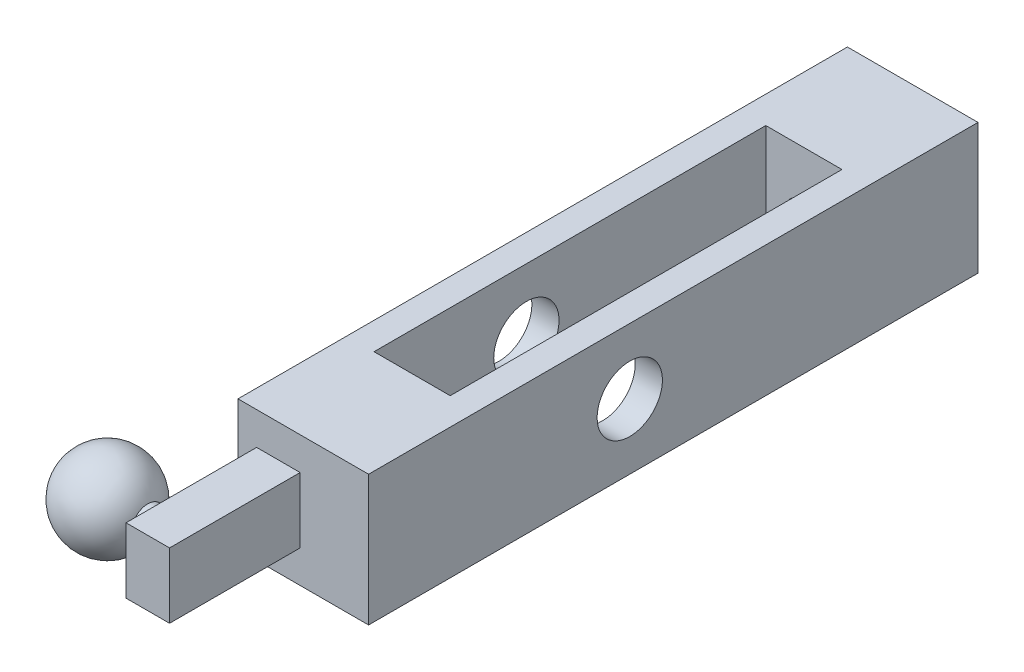
ISO-10303-21;
HEADER;
FILE_DESCRIPTION(('STEP AP214'),'2;1');
FILE_NAME('part.step','',(''),(''),'','','');
FILE_SCHEMA(('AUTOMOTIVE_DESIGN { 1 0 10303 214 1 1 1 1 }'));
ENDSEC;
DATA;
#1=APPLICATION_CONTEXT('core data for automotive mechanical design processes');
#2=APPLICATION_PROTOCOL_DEFINITION('international standard','automotive_design',2000,#1);
#3=PRODUCT_CONTEXT('',#1,'mechanical');
#4=PRODUCT('Part','Part','',(#3));
#5=PRODUCT_RELATED_PRODUCT_CATEGORY('part','',(#4));
#6=PRODUCT_DEFINITION_FORMATION('','',#4);
#7=PRODUCT_DEFINITION_CONTEXT('part definition',#1,'design');
#8=PRODUCT_DEFINITION('design','',#6,#7);
#9=PRODUCT_DEFINITION_SHAPE('','',#8);
#10=(LENGTH_UNIT() NAMED_UNIT(*) SI_UNIT(.MILLI.,.METRE.));
#11=(NAMED_UNIT(*) PLANE_ANGLE_UNIT() SI_UNIT($,.RADIAN.));
#12=(NAMED_UNIT(*) SI_UNIT($,.STERADIAN.) SOLID_ANGLE_UNIT());
#13=UNCERTAINTY_MEASURE_WITH_UNIT(LENGTH_MEASURE(1.E-05),#10,'distance_accuracy_value','');
#14=(GEOMETRIC_REPRESENTATION_CONTEXT(3) GLOBAL_UNCERTAINTY_ASSIGNED_CONTEXT((#13)) GLOBAL_UNIT_ASSIGNED_CONTEXT((#10,
#11,#12)) REPRESENTATION_CONTEXT('',''));
#15=CARTESIAN_POINT('',(0.,0.,0.));
#16=DIRECTION('',(0.,0.,1.));
#17=DIRECTION('',(1.,0.,0.));
#18=AXIS2_PLACEMENT_3D('',#15,#16,#17);
#19=CARTESIAN_POINT('',(3.,-3.,28.));
#20=DIRECTION('',(0.,1.,0.));
#21=DIRECTION('',(-1.,0.,0.));
#22=AXIS2_PLACEMENT_3D('',#19,#20,#21);
#23=PLANE('',#22);
#24=DIRECTION('',(1.,0.,0.));
#25=VECTOR('',#24,1.);
#26=CARTESIAN_POINT('',(3.,-3.,0.));
#27=LINE('',#26,#25);
#28=CARTESIAN_POINT('',(-3.,-3.,0.));
#29=VERTEX_POINT('',#28);
#30=CARTESIAN_POINT('',(3.,-3.,0.));
#31=VERTEX_POINT('',#30);
#32=EDGE_CURVE('E218',#29,#31,#27,.T.);
#33=ORIENTED_EDGE('',*,*,#32,.T.);
#34=DIRECTION('',(0.,0.,-1.));
#35=VECTOR('',#34,1.);
#36=CARTESIAN_POINT('',(3.,-3.,28.));
#37=LINE('',#36,#35);
#38=CARTESIAN_POINT('',(3.,-3.,28.));
#39=VERTEX_POINT('',#38);
#40=EDGE_CURVE('E228',#39,#31,#37,.T.);
#41=ORIENTED_EDGE('',*,*,#40,.F.);
#42=DIRECTION('',(1.,0.,0.));
#43=VECTOR('',#42,1.);
#44=CARTESIAN_POINT('',(3.,-3.,28.));
#45=LINE('',#44,#43);
#46=CARTESIAN_POINT('',(-3.,-3.,28.));
#47=VERTEX_POINT('',#46);
#48=EDGE_CURVE('E208',#47,#39,#45,.T.);
#49=ORIENTED_EDGE('',*,*,#48,.F.);
#50=DIRECTION('',(0.,0.,-1.));
#51=VECTOR('',#50,1.);
#52=CARTESIAN_POINT('',(-3.,-3.,28.));
#53=LINE('',#52,#51);
#54=EDGE_CURVE('E50',#47,#29,#53,.T.);
#55=ORIENTED_EDGE('',*,*,#54,.T.);
#56=EDGE_LOOP('',(#33,#41,#49,#55));
#57=FACE_BOUND('',#56,.T.);
#58=DIRECTION('',(1.,0.,0.));
#59=VECTOR('',#58,1.);
#60=CARTESIAN_POINT('',(3.,-3.,5.));
#61=LINE('',#60,#59);
#62=CARTESIAN_POINT('',(-1.75,-3.,5.));
#63=VERTEX_POINT('',#62);
#64=CARTESIAN_POINT('',(1.75,-3.,5.));
#65=VERTEX_POINT('',#64);
#66=EDGE_CURVE('E135',#63,#65,#61,.T.);
#67=ORIENTED_EDGE('',*,*,#66,.F.);
#68=DIRECTION('',(0.,0.,-1.));
#69=VECTOR('',#68,1.);
#70=CARTESIAN_POINT('',(-1.75,-3.,28.));
#71=LINE('',#70,#69);
#72=CARTESIAN_POINT('',(-1.75,-3.,23.));
#73=VERTEX_POINT('',#72);
#74=EDGE_CURVE('E138',#73,#63,#71,.T.);
#75=ORIENTED_EDGE('',*,*,#74,.F.);
#76=DIRECTION('',(-1.,0.,0.));
#77=VECTOR('',#76,1.);
#78=CARTESIAN_POINT('',(3.,-3.,23.));
#79=LINE('',#78,#77);
#80=CARTESIAN_POINT('',(1.75,-3.,23.));
#81=VERTEX_POINT('',#80);
#82=EDGE_CURVE('E167',#81,#73,#79,.T.);
#83=ORIENTED_EDGE('',*,*,#82,.F.);
#84=DIRECTION('',(0.,0.,1.));
#85=VECTOR('',#84,1.);
#86=CARTESIAN_POINT('',(1.75,-3.,28.));
#87=LINE('',#86,#85);
#88=EDGE_CURVE('E169',#65,#81,#87,.T.);
#89=ORIENTED_EDGE('',*,*,#88,.F.);
#90=EDGE_LOOP('',(#67,#75,#83,#89));
#91=FACE_BOUND('',#90,.T.);
#92=ADVANCED_FACE('F41',(#57,#91),#23,.F.);
#93=CARTESIAN_POINT('',(3.,3.,28.));
#94=DIRECTION('',(0.,-1.,0.));
#95=DIRECTION('',(1.,0.,0.));
#96=AXIS2_PLACEMENT_3D('',#93,#94,#95);
#97=PLANE('',#96);
#98=DIRECTION('',(-1.,0.,0.));
#99=VECTOR('',#98,1.);
#100=CARTESIAN_POINT('',(3.,3.,0.));
#101=LINE('',#100,#99);
#102=CARTESIAN_POINT('',(3.,3.,0.));
#103=VERTEX_POINT('',#102);
#104=CARTESIAN_POINT('',(-3.,3.,0.));
#105=VERTEX_POINT('',#104);
#106=EDGE_CURVE('E209',#103,#105,#101,.T.);
#107=ORIENTED_EDGE('',*,*,#106,.T.);
#108=DIRECTION('',(0.,0.,-1.));
#109=VECTOR('',#108,1.);
#110=CARTESIAN_POINT('',(-3.,3.,28.));
#111=LINE('',#110,#109);
#112=CARTESIAN_POINT('',(-3.,3.,28.));
#113=VERTEX_POINT('',#112);
#114=EDGE_CURVE('E215',#113,#105,#111,.T.);
#115=ORIENTED_EDGE('',*,*,#114,.F.);
#116=DIRECTION('',(-1.,0.,0.));
#117=VECTOR('',#116,1.);
#118=CARTESIAN_POINT('',(3.,3.,28.));
#119=LINE('',#118,#117);
#120=CARTESIAN_POINT('',(3.,3.,28.));
#121=VERTEX_POINT('',#120);
#122=EDGE_CURVE('E213',#121,#113,#119,.T.);
#123=ORIENTED_EDGE('',*,*,#122,.F.);
#124=DIRECTION('',(0.,0.,-1.));
#125=VECTOR('',#124,1.);
#126=CARTESIAN_POINT('',(3.,3.,28.));
#127=LINE('',#126,#125);
#128=EDGE_CURVE('E225',#121,#103,#127,.T.);
#129=ORIENTED_EDGE('',*,*,#128,.T.);
#130=EDGE_LOOP('',(#107,#115,#123,#129));
#131=FACE_BOUND('',#130,.T.);
#132=DIRECTION('',(1.,0.,0.));
#133=VECTOR('',#132,1.);
#134=CARTESIAN_POINT('',(-1.75,3.,5.));
#135=LINE('',#134,#133);
#136=CARTESIAN_POINT('',(-1.75,3.,5.));
#137=VERTEX_POINT('',#136);
#138=CARTESIAN_POINT('',(1.75,3.,5.));
#139=VERTEX_POINT('',#138);
#140=EDGE_CURVE('E66',#137,#139,#135,.T.);
#141=ORIENTED_EDGE('',*,*,#140,.T.);
#142=DIRECTION('',(0.,0.,1.));
#143=VECTOR('',#142,1.);
#144=CARTESIAN_POINT('',(1.75,3.,5.));
#145=LINE('',#144,#143);
#146=CARTESIAN_POINT('',(1.75,3.,23.));
#147=VERTEX_POINT('',#146);
#148=EDGE_CURVE('E142',#139,#147,#145,.T.);
#149=ORIENTED_EDGE('',*,*,#148,.T.);
#150=DIRECTION('',(-1.,0.,0.));
#151=VECTOR('',#150,1.);
#152=CARTESIAN_POINT('',(-1.75,3.,23.));
#153=LINE('',#152,#151);
#154=CARTESIAN_POINT('',(-1.75,3.,23.));
#155=VERTEX_POINT('',#154);
#156=EDGE_CURVE('E148',#147,#155,#153,.T.);
#157=ORIENTED_EDGE('',*,*,#156,.T.);
#158=DIRECTION('',(0.,0.,-1.));
#159=VECTOR('',#158,1.);
#160=CARTESIAN_POINT('',(-1.75,3.,5.));
#161=LINE('',#160,#159);
#162=EDGE_CURVE('E152',#155,#137,#161,.T.);
#163=ORIENTED_EDGE('',*,*,#162,.T.);
#164=EDGE_LOOP('',(#141,#149,#157,#163));
#165=FACE_BOUND('',#164,.T.);
#166=ADVANCED_FACE('F151',(#131,#165),#97,.F.);
#167=CARTESIAN_POINT('',(0.,0.,28.));
#168=DIRECTION('',(0.,0.,1.));
#169=DIRECTION('',(1.,0.,0.));
#170=AXIS2_PLACEMENT_3D('',#167,#168,#169);
#171=PLANE('',#170);
#172=DIRECTION('',(0.,-1.,0.));
#173=VECTOR('',#172,1.);
#174=CARTESIAN_POINT('',(-3.,-3.,28.));
#175=LINE('',#174,#173);
#176=EDGE_CURVE('E205',#113,#47,#175,.T.);
#177=ORIENTED_EDGE('',*,*,#176,.T.);
#178=ORIENTED_EDGE('',*,*,#48,.T.);
#179=DIRECTION('',(0.,1.,0.));
#180=VECTOR('',#179,1.);
#181=CARTESIAN_POINT('',(3.,-3.,28.));
#182=LINE('',#181,#180);
#183=EDGE_CURVE('E211',#39,#121,#182,.T.);
#184=ORIENTED_EDGE('',*,*,#183,.T.);
#185=ORIENTED_EDGE('',*,*,#122,.T.);
#186=EDGE_LOOP('',(#177,#178,#184,#185));
#187=FACE_BOUND('',#186,.T.);
#188=DIRECTION('',(-1.,0.,0.));
#189=VECTOR('',#188,1.);
#190=CARTESIAN_POINT('',(-2.14479354998716,1.49545918544692,28.));
#191=LINE('',#190,#189);
#192=CARTESIAN_POINT('',(-0.144793549987163,1.49545918544692,28.));
#193=VERTEX_POINT('',#192);
#194=CARTESIAN_POINT('',(-2.14479354998716,1.49545918544692,28.));
#195=VERTEX_POINT('',#194);
#196=EDGE_CURVE('E189',#193,#195,#191,.T.);
#197=ORIENTED_EDGE('',*,*,#196,.F.);
#198=DIRECTION('',(0.,1.,0.));
#199=VECTOR('',#198,1.);
#200=CARTESIAN_POINT('',(-0.144793549987163,1.49545918544692,28.));
#201=LINE('',#200,#199);
#202=CARTESIAN_POINT('',(-0.144793549987163,-1.50454081455308,28.));
#203=VERTEX_POINT('',#202);
#204=EDGE_CURVE('E175',#203,#193,#201,.T.);
#205=ORIENTED_EDGE('',*,*,#204,.F.);
#206=DIRECTION('',(1.,0.,0.));
#207=VECTOR('',#206,1.);
#208=CARTESIAN_POINT('',(-2.14479354998716,-1.50454081455308,28.));
#209=LINE('',#208,#207);
#210=CARTESIAN_POINT('',(-2.14479354998716,-1.50454081455308,28.));
#211=VERTEX_POINT('',#210);
#212=EDGE_CURVE('E180',#211,#203,#209,.T.);
#213=ORIENTED_EDGE('',*,*,#212,.F.);
#214=DIRECTION('',(0.,-1.,0.));
#215=VECTOR('',#214,1.);
#216=CARTESIAN_POINT('',(-2.14479354998716,1.49545918544692,28.));
#217=LINE('',#216,#215);
#218=EDGE_CURVE('E191',#195,#211,#217,.T.);
#219=ORIENTED_EDGE('',*,*,#218,.F.);
#220=EDGE_LOOP('',(#197,#205,#213,#219));
#221=FACE_BOUND('',#220,.T.);
#222=ADVANCED_FACE('F272',(#187,#221),#171,.T.);
#223=CARTESIAN_POINT('',(-3.,-3.,28.));
#224=DIRECTION('',(1.,0.,0.));
#225=DIRECTION('',(0.,0.,-1.));
#226=AXIS2_PLACEMENT_3D('',#223,#224,#225);
#227=PLANE('',#226);
#228=CARTESIAN_POINT('',(-3.,0.,16.));
#229=DIRECTION('',(-1.,0.,0.));
#230=DIRECTION('',(0.,0.,1.));
#231=AXIS2_PLACEMENT_3D('',#228,#229,#230);
#232=CIRCLE('',#231,1.5);
#233=CARTESIAN_POINT('',(-3.,0.,17.5));
#234=VERTEX_POINT('',#233);
#235=EDGE_CURVE('E234',#234,#234,#232,.T.);
#236=ORIENTED_EDGE('',*,*,#235,.F.);
#237=EDGE_LOOP('',(#236));
#238=FACE_BOUND('',#237,.T.);
#239=DIRECTION('',(0.,-1.,0.));
#240=VECTOR('',#239,1.);
#241=CARTESIAN_POINT('',(-3.,-3.,0.));
#242=LINE('',#241,#240);
#243=EDGE_CURVE('E204',#105,#29,#242,.T.);
#244=ORIENTED_EDGE('',*,*,#243,.T.);
#245=ORIENTED_EDGE('',*,*,#54,.F.);
#246=ORIENTED_EDGE('',*,*,#176,.F.);
#247=ORIENTED_EDGE('',*,*,#114,.T.);
#248=EDGE_LOOP('',(#244,#245,#246,#247));
#249=FACE_BOUND('',#248,.T.);
#250=ADVANCED_FACE('F43',(#238,#249),#227,.F.);
#251=CARTESIAN_POINT('',(3.,-3.,28.));
#252=DIRECTION('',(-1.,0.,0.));
#253=DIRECTION('',(0.,0.,1.));
#254=AXIS2_PLACEMENT_3D('',#251,#252,#253);
#255=PLANE('',#254);
#256=CARTESIAN_POINT('',(3.,0.,16.));
#257=DIRECTION('',(-1.,0.,0.));
#258=DIRECTION('',(0.,0.,1.));
#259=AXIS2_PLACEMENT_3D('',#256,#257,#258);
#260=CIRCLE('',#259,1.5);
#261=CARTESIAN_POINT('',(3.,0.,17.5));
#262=VERTEX_POINT('',#261);
#263=EDGE_CURVE('E153',#262,#262,#260,.T.);
#264=ORIENTED_EDGE('',*,*,#263,.T.);
#265=EDGE_LOOP('',(#264));
#266=FACE_BOUND('',#265,.T.);
#267=DIRECTION('',(0.,1.,0.));
#268=VECTOR('',#267,1.);
#269=CARTESIAN_POINT('',(3.,-3.,0.));
#270=LINE('',#269,#268);
#271=EDGE_CURVE('E220',#31,#103,#270,.T.);
#272=ORIENTED_EDGE('',*,*,#271,.T.);
#273=ORIENTED_EDGE('',*,*,#128,.F.);
#274=ORIENTED_EDGE('',*,*,#183,.F.);
#275=ORIENTED_EDGE('',*,*,#40,.T.);
#276=EDGE_LOOP('',(#272,#273,#274,#275));
#277=FACE_BOUND('',#276,.T.);
#278=ADVANCED_FACE('F254',(#266,#277),#255,.F.);
#279=CARTESIAN_POINT('',(0.,0.,0.));
#280=DIRECTION('',(0.,0.,1.));
#281=DIRECTION('',(1.,0.,0.));
#282=AXIS2_PLACEMENT_3D('',#279,#280,#281);
#283=PLANE('',#282);
#284=CARTESIAN_POINT('',(0.,0.,0.));
#285=DIRECTION('',(0.,0.,-1.));
#286=DIRECTION('',(-1.,0.,0.));
#287=AXIS2_PLACEMENT_3D('',#284,#285,#286);
#288=CIRCLE('',#287,0.9);
#289=CARTESIAN_POINT('',(-0.9,0.,0.));
#290=VERTEX_POINT('',#289);
#291=EDGE_CURVE('E243',#290,#290,#288,.T.);
#292=ORIENTED_EDGE('',*,*,#291,.F.);
#293=EDGE_LOOP('',(#292));
#294=FACE_BOUND('',#293,.T.);
#295=ORIENTED_EDGE('',*,*,#243,.F.);
#296=ORIENTED_EDGE('',*,*,#106,.F.);
#297=ORIENTED_EDGE('',*,*,#271,.F.);
#298=ORIENTED_EDGE('',*,*,#32,.F.);
#299=EDGE_LOOP('',(#295,#296,#297,#298));
#300=FACE_BOUND('',#299,.T.);
#301=ADVANCED_FACE('F250',(#294,#300),#283,.F.);
#302=CARTESIAN_POINT('',(-0.144793549987163,1.49545918544692,34.));
#303=DIRECTION('',(-1.,0.,0.));
#304=DIRECTION('',(0.,-1.,0.));
#305=AXIS2_PLACEMENT_3D('',#302,#303,#304);
#306=PLANE('',#305);
#307=ORIENTED_EDGE('',*,*,#204,.T.);
#308=DIRECTION('',(0.,0.,-1.));
#309=VECTOR('',#308,1.);
#310=CARTESIAN_POINT('',(-0.144793549987163,1.49545918544692,34.));
#311=LINE('',#310,#309);
#312=CARTESIAN_POINT('',(-0.144793549987163,1.49545918544692,34.));
#313=VERTEX_POINT('',#312);
#314=EDGE_CURVE('E202',#313,#193,#311,.T.);
#315=ORIENTED_EDGE('',*,*,#314,.F.);
#316=DIRECTION('',(0.,1.,0.));
#317=VECTOR('',#316,1.);
#318=CARTESIAN_POINT('',(-0.144793549987163,1.49545918544692,34.));
#319=LINE('',#318,#317);
#320=CARTESIAN_POINT('',(-0.144793549987163,-1.50454081455308,34.));
#321=VERTEX_POINT('',#320);
#322=EDGE_CURVE('E176',#321,#313,#319,.T.);
#323=ORIENTED_EDGE('',*,*,#322,.F.);
#324=DIRECTION('',(0.,0.,-1.));
#325=VECTOR('',#324,1.);
#326=CARTESIAN_POINT('',(-0.144793549987163,-1.50454081455308,34.));
#327=LINE('',#326,#325);
#328=EDGE_CURVE('E186',#321,#203,#327,.T.);
#329=ORIENTED_EDGE('',*,*,#328,.T.);
#330=EDGE_LOOP('',(#307,#315,#323,#329));
#331=FACE_BOUND('',#330,.T.);
#332=ADVANCED_FACE('F253',(#331),#306,.F.);
#333=CARTESIAN_POINT('',(-2.14479354998716,1.49545918544692,34.));
#334=DIRECTION('',(0.,-1.,0.));
#335=DIRECTION('',(1.,0.,0.));
#336=AXIS2_PLACEMENT_3D('',#333,#334,#335);
#337=PLANE('',#336);
#338=ORIENTED_EDGE('',*,*,#196,.T.);
#339=DIRECTION('',(0.,0.,-1.));
#340=VECTOR('',#339,1.);
#341=CARTESIAN_POINT('',(-2.14479354998716,1.49545918544692,34.));
#342=LINE('',#341,#340);
#343=CARTESIAN_POINT('',(-2.14479354998716,1.49545918544692,34.));
#344=VERTEX_POINT('',#343);
#345=EDGE_CURVE('E199',#344,#195,#342,.T.);
#346=ORIENTED_EDGE('',*,*,#345,.F.);
#347=DIRECTION('',(-1.,0.,0.));
#348=VECTOR('',#347,1.);
#349=CARTESIAN_POINT('',(-2.14479354998716,1.49545918544692,34.));
#350=LINE('',#349,#348);
#351=EDGE_CURVE('E179',#313,#344,#350,.T.);
#352=ORIENTED_EDGE('',*,*,#351,.F.);
#353=ORIENTED_EDGE('',*,*,#314,.T.);
#354=EDGE_LOOP('',(#338,#346,#352,#353));
#355=FACE_BOUND('',#354,.T.);
#356=ADVANCED_FACE('F282',(#355),#337,.F.);
#357=CARTESIAN_POINT('',(-2.14479354998716,1.49545918544692,34.));
#358=DIRECTION('',(1.,0.,0.));
#359=DIRECTION('',(0.,1.,0.));
#360=AXIS2_PLACEMENT_3D('',#357,#358,#359);
#361=PLANE('',#360);
#362=CARTESIAN_POINT('',(-2.14479354998716,0.,32.));
#363=DIRECTION('',(1.,0.,0.));
#364=DIRECTION('',(0.,1.,0.));
#365=AXIS2_PLACEMENT_3D('',#362,#363,#364);
#366=CIRCLE('',#365,0.749999999999999);
#367=CARTESIAN_POINT('',(-2.14479354998716,0.749999999999998,32.));
#368=VERTEX_POINT('',#367);
#369=EDGE_CURVE('E11',#368,#368,#366,.F.);
#370=ORIENTED_EDGE('',*,*,#369,.F.);
#371=EDGE_LOOP('',(#370));
#372=FACE_BOUND('',#371,.T.);
#373=ORIENTED_EDGE('',*,*,#218,.T.);
#374=DIRECTION('',(0.,0.,-1.));
#375=VECTOR('',#374,1.);
#376=CARTESIAN_POINT('',(-2.14479354998716,-1.50454081455308,34.));
#377=LINE('',#376,#375);
#378=CARTESIAN_POINT('',(-2.14479354998716,-1.50454081455308,34.));
#379=VERTEX_POINT('',#378);
#380=EDGE_CURVE('E197',#379,#211,#377,.T.);
#381=ORIENTED_EDGE('',*,*,#380,.F.);
#382=DIRECTION('',(0.,-1.,0.));
#383=VECTOR('',#382,1.);
#384=CARTESIAN_POINT('',(-2.14479354998716,1.49545918544692,34.));
#385=LINE('',#384,#383);
#386=EDGE_CURVE('E182',#344,#379,#385,.T.);
#387=ORIENTED_EDGE('',*,*,#386,.F.);
#388=ORIENTED_EDGE('',*,*,#345,.T.);
#389=EDGE_LOOP('',(#373,#381,#387,#388));
#390=FACE_BOUND('',#389,.T.);
#391=ADVANCED_FACE('F286',(#372,#390),#361,.F.);
#392=CARTESIAN_POINT('',(-2.14479354998716,-1.50454081455308,34.));
#393=DIRECTION('',(0.,1.,0.));
#394=DIRECTION('',(-1.,0.,0.));
#395=AXIS2_PLACEMENT_3D('',#392,#393,#394);
#396=PLANE('',#395);
#397=ORIENTED_EDGE('',*,*,#212,.T.);
#398=ORIENTED_EDGE('',*,*,#328,.F.);
#399=DIRECTION('',(1.,0.,0.));
#400=VECTOR('',#399,1.);
#401=CARTESIAN_POINT('',(-2.14479354998716,-1.50454081455308,34.));
#402=LINE('',#401,#400);
#403=EDGE_CURVE('E184',#379,#321,#402,.T.);
#404=ORIENTED_EDGE('',*,*,#403,.F.);
#405=ORIENTED_EDGE('',*,*,#380,.T.);
#406=EDGE_LOOP('',(#397,#398,#404,#405));
#407=FACE_BOUND('',#406,.T.);
#408=ADVANCED_FACE('F295',(#407),#396,.F.);
#409=CARTESIAN_POINT('',(0.,0.,34.));
#410=DIRECTION('',(0.,0.,1.));
#411=DIRECTION('',(1.,0.,0.));
#412=AXIS2_PLACEMENT_3D('',#409,#410,#411);
#413=PLANE('',#412);
#414=ORIENTED_EDGE('',*,*,#322,.T.);
#415=ORIENTED_EDGE('',*,*,#351,.T.);
#416=ORIENTED_EDGE('',*,*,#386,.T.);
#417=ORIENTED_EDGE('',*,*,#403,.T.);
#418=EDGE_LOOP('',(#414,#415,#416,#417));
#419=FACE_BOUND('',#418,.T.);
#420=ADVANCED_FACE('F290',(#419),#413,.T.);
#421=CARTESIAN_POINT('',(-3.14479354998716,0.,32.));
#422=DIRECTION('',(1.,0.,0.));
#423=DIRECTION('',(0.,1.,0.));
#424=AXIS2_PLACEMENT_3D('',#421,#422,#423);
#425=CYLINDRICAL_SURFACE('',#424,0.749999999999999);
#426=CARTESIAN_POINT('',(-3.14479354998716,0.,32.));
#427=DIRECTION('',(-1.,0.,0.));
#428=DIRECTION('',(0.,-1.,0.));
#429=AXIS2_PLACEMENT_3D('',#426,#427,#428);
#430=CIRCLE('',#429,0.749999999999999);
#431=CARTESIAN_POINT('',(-3.14479354998716,-0.749999999999999,32.));
#432=VERTEX_POINT('',#431);
#433=EDGE_CURVE('E172',#432,#432,#430,.T.);
#434=ORIENTED_EDGE('',*,*,#433,.F.);
#435=EDGE_LOOP('',(#434));
#436=FACE_BOUND('',#435,.T.);
#437=ORIENTED_EDGE('',*,*,#369,.T.);
#438=EDGE_LOOP('',(#437));
#439=FACE_BOUND('',#438,.T.);
#440=ADVANCED_FACE('F302',(#436,#439),#425,.T.);
#441=CARTESIAN_POINT('',(-4.99884317176108,0.,32.));
#442=DIRECTION('',(1.,0.,0.));
#443=DIRECTION('',(0.,0.,-1.));
#444=AXIS2_PLACEMENT_3D('',#441,#442,#443);
#445=SPHERICAL_SURFACE('',#444,2.);
#446=ORIENTED_EDGE('',*,*,#433,.T.);
#447=EDGE_LOOP('',(#446));
#448=FACE_BOUND('',#447,.T.);
#449=ADVANCED_FACE('F360',(#448),#445,.T.);
#450=CARTESIAN_POINT('',(-1.75,-5.,5.));
#451=DIRECTION('',(0.,0.,1.));
#452=DIRECTION('',(1.,0.,0.));
#453=AXIS2_PLACEMENT_3D('',#450,#451,#452);
#454=PLANE('',#453);
#455=CARTESIAN_POINT('',(0.,0.,5.));
#456=DIRECTION('',(0.,0.,1.));
#457=DIRECTION('',(1.,0.,0.));
#458=AXIS2_PLACEMENT_3D('',#455,#456,#457);
#459=CIRCLE('',#458,0.9);
#460=CARTESIAN_POINT('',(0.9,0.,5.));
#461=VERTEX_POINT('',#460);
#462=EDGE_CURVE('E45',#461,#461,#459,.T.);
#463=ORIENTED_EDGE('',*,*,#462,.F.);
#464=EDGE_LOOP('',(#463));
#465=FACE_BOUND('',#464,.T.);
#466=ORIENTED_EDGE('',*,*,#66,.T.);
#467=DIRECTION('',(0.,1.,0.));
#468=VECTOR('',#467,1.);
#469=CARTESIAN_POINT('',(1.75,-5.,5.));
#470=LINE('',#469,#468);
#471=EDGE_CURVE('E131',#65,#139,#470,.T.);
#472=ORIENTED_EDGE('',*,*,#471,.T.);
#473=ORIENTED_EDGE('',*,*,#140,.F.);
#474=DIRECTION('',(0.,1.,0.));
#475=VECTOR('',#474,1.);
#476=CARTESIAN_POINT('',(-1.75,-5.,5.));
#477=LINE('',#476,#475);
#478=EDGE_CURVE('E162',#63,#137,#477,.T.);
#479=ORIENTED_EDGE('',*,*,#478,.F.);
#480=EDGE_LOOP('',(#466,#472,#473,#479));
#481=FACE_BOUND('',#480,.T.);
#482=ADVANCED_FACE('F133',(#465,#481),#454,.T.);
#483=CARTESIAN_POINT('',(1.75,-5.,5.));
#484=DIRECTION('',(-1.,0.,0.));
#485=DIRECTION('',(0.,-1.,0.));
#486=AXIS2_PLACEMENT_3D('',#483,#484,#485);
#487=PLANE('',#486);
#488=CARTESIAN_POINT('',(1.75,0.,16.));
#489=DIRECTION('',(-1.,0.,0.));
#490=DIRECTION('',(0.,-1.,0.));
#491=AXIS2_PLACEMENT_3D('',#488,#489,#490);
#492=CIRCLE('',#491,1.5);
#493=CARTESIAN_POINT('',(1.75,-1.5,16.));
#494=VERTEX_POINT('',#493);
#495=EDGE_CURVE('E156',#494,#494,#492,.T.);
#496=ORIENTED_EDGE('',*,*,#495,.F.);
#497=EDGE_LOOP('',(#496));
#498=FACE_BOUND('',#497,.T.);
#499=ORIENTED_EDGE('',*,*,#88,.T.);
#500=DIRECTION('',(0.,1.,0.));
#501=VECTOR('',#500,1.);
#502=CARTESIAN_POINT('',(1.75,-5.,23.));
#503=LINE('',#502,#501);
#504=EDGE_CURVE('E139',#81,#147,#503,.T.);
#505=ORIENTED_EDGE('',*,*,#504,.T.);
#506=ORIENTED_EDGE('',*,*,#148,.F.);
#507=ORIENTED_EDGE('',*,*,#471,.F.);
#508=EDGE_LOOP('',(#499,#505,#506,#507));
#509=FACE_BOUND('',#508,.T.);
#510=ADVANCED_FACE('F143',(#498,#509),#487,.T.);
#511=CARTESIAN_POINT('',(-1.75000000000001,-5.,23.));
#512=DIRECTION('',(0.,0.,-1.));
#513=DIRECTION('',(-1.,0.,0.));
#514=AXIS2_PLACEMENT_3D('',#511,#512,#513);
#515=PLANE('',#514);
#516=ORIENTED_EDGE('',*,*,#82,.T.);
#517=DIRECTION('',(0.,1.,0.));
#518=VECTOR('',#517,1.);
#519=CARTESIAN_POINT('',(-1.75000000000001,-5.,23.));
#520=LINE('',#519,#518);
#521=EDGE_CURVE('E58',#73,#155,#520,.T.);
#522=ORIENTED_EDGE('',*,*,#521,.T.);
#523=ORIENTED_EDGE('',*,*,#156,.F.);
#524=ORIENTED_EDGE('',*,*,#504,.F.);
#525=EDGE_LOOP('',(#516,#522,#523,#524));
#526=FACE_BOUND('',#525,.T.);
#527=ADVANCED_FACE('F395',(#526),#515,.T.);
#528=CARTESIAN_POINT('',(-1.75,-5.,5.));
#529=DIRECTION('',(1.,0.,0.));
#530=DIRECTION('',(0.,1.,0.));
#531=AXIS2_PLACEMENT_3D('',#528,#529,#530);
#532=PLANE('',#531);
#533=CARTESIAN_POINT('',(-1.75,0.,16.));
#534=DIRECTION('',(1.,0.,0.));
#535=DIRECTION('',(0.,1.,0.));
#536=AXIS2_PLACEMENT_3D('',#533,#534,#535);
#537=CIRCLE('',#536,1.5);
#538=CARTESIAN_POINT('',(-1.75,1.5,16.));
#539=VERTEX_POINT('',#538);
#540=EDGE_CURVE('E232',#539,#539,#537,.T.);
#541=ORIENTED_EDGE('',*,*,#540,.F.);
#542=EDGE_LOOP('',(#541));
#543=FACE_BOUND('',#542,.T.);
#544=ORIENTED_EDGE('',*,*,#74,.T.);
#545=ORIENTED_EDGE('',*,*,#478,.T.);
#546=ORIENTED_EDGE('',*,*,#162,.F.);
#547=ORIENTED_EDGE('',*,*,#521,.F.);
#548=EDGE_LOOP('',(#544,#545,#546,#547));
#549=FACE_BOUND('',#548,.T.);
#550=ADVANCED_FACE('F403',(#543,#549),#532,.T.);
#551=CARTESIAN_POINT('',(5.,0.,16.));
#552=DIRECTION('',(-1.,0.,0.));
#553=DIRECTION('',(0.,0.,1.));
#554=AXIS2_PLACEMENT_3D('',#551,#552,#553);
#555=CYLINDRICAL_SURFACE('',#554,1.5);
#556=ORIENTED_EDGE('',*,*,#540,.T.);
#557=EDGE_LOOP('',(#556));
#558=FACE_BOUND('',#557,.T.);
#559=ORIENTED_EDGE('',*,*,#235,.T.);
#560=EDGE_LOOP('',(#559));
#561=FACE_BOUND('',#560,.T.);
#562=ADVANCED_FACE('F412',(#558,#561),#555,.F.);
#563=ORIENTED_EDGE('',*,*,#495,.T.);
#564=EDGE_LOOP('',(#563));
#565=FACE_BOUND('',#564,.T.);
#566=ORIENTED_EDGE('',*,*,#263,.F.);
#567=EDGE_LOOP('',(#566));
#568=FACE_BOUND('',#567,.T.);
#569=ADVANCED_FACE('F421',(#565,#568),#555,.F.);
#570=CARTESIAN_POINT('',(0.,0.,8.));
#571=DIRECTION('',(0.,0.,-1.));
#572=DIRECTION('',(-1.,0.,0.));
#573=AXIS2_PLACEMENT_3D('',#570,#571,#572);
#574=CYLINDRICAL_SURFACE('',#573,0.9);
#575=ORIENTED_EDGE('',*,*,#462,.T.);
#576=EDGE_LOOP('',(#575));
#577=FACE_BOUND('',#576,.T.);
#578=ORIENTED_EDGE('',*,*,#291,.T.);
#579=EDGE_LOOP('',(#578));
#580=FACE_BOUND('',#579,.T.);
#581=ADVANCED_FACE('F248',(#577,#580),#574,.F.);
#582=CLOSED_SHELL('',(#92,#166,#222,#250,#278,#301,#332,#356,#391,#408,#420,#440,#449,#482,#510,
#527,#550,#562,#569,#581));
#583=MANIFOLD_SOLID_BREP('B2',#582);
#584=ADVANCED_BREP_SHAPE_REPRESENTATION('',(#18,#583),#14);
#585=SHAPE_DEFINITION_REPRESENTATION(#9,#584);
ENDSEC;
END-ISO-10303-21;
